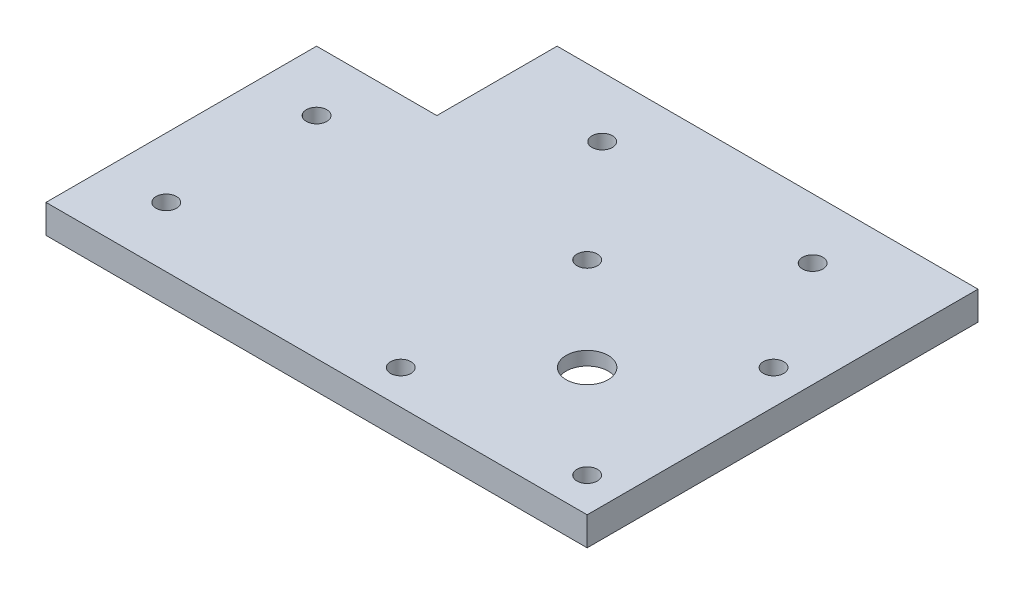
ISO-10303-21;
HEADER;
FILE_DESCRIPTION(('STEP AP214'),'2;1');
FILE_NAME('part.step','',(''),(''),'','','');
FILE_SCHEMA(('AUTOMOTIVE_DESIGN { 1 0 10303 214 1 1 1 1 }'));
ENDSEC;
DATA;
#1=APPLICATION_CONTEXT('core data for automotive mechanical design processes');
#2=APPLICATION_PROTOCOL_DEFINITION('international standard','automotive_design',2000,#1);
#3=PRODUCT_CONTEXT('',#1,'mechanical');
#4=PRODUCT('Part','Part','',(#3));
#5=PRODUCT_RELATED_PRODUCT_CATEGORY('part','',(#4));
#6=PRODUCT_DEFINITION_FORMATION('','',#4);
#7=PRODUCT_DEFINITION_CONTEXT('part definition',#1,'design');
#8=PRODUCT_DEFINITION('design','',#6,#7);
#9=PRODUCT_DEFINITION_SHAPE('','',#8);
#10=(LENGTH_UNIT() NAMED_UNIT(*) SI_UNIT(.MILLI.,.METRE.));
#11=(NAMED_UNIT(*) PLANE_ANGLE_UNIT() SI_UNIT($,.RADIAN.));
#12=(NAMED_UNIT(*) SI_UNIT($,.STERADIAN.) SOLID_ANGLE_UNIT());
#13=UNCERTAINTY_MEASURE_WITH_UNIT(LENGTH_MEASURE(1.E-05),#10,'distance_accuracy_value','');
#14=(GEOMETRIC_REPRESENTATION_CONTEXT(3) GLOBAL_UNCERTAINTY_ASSIGNED_CONTEXT((#13)) GLOBAL_UNIT_ASSIGNED_CONTEXT((#10,
#11,#12)) REPRESENTATION_CONTEXT('',''));
#15=CARTESIAN_POINT('',(0.,0.,0.));
#16=DIRECTION('',(0.,0.,1.));
#17=DIRECTION('',(1.,0.,0.));
#18=AXIS2_PLACEMENT_3D('',#15,#16,#17);
#19=CARTESIAN_POINT('',(68.7909999999999,0.,-21.209));
#20=DIRECTION('',(0.,-1.,0.));
#21=DIRECTION('',(0.,0.,-1.));
#22=AXIS2_PLACEMENT_3D('',#19,#20,#21);
#23=CYLINDRICAL_SURFACE('',#22,3.5);
#24=CARTESIAN_POINT('',(68.7909999999999,4.7625,-21.209));
#25=DIRECTION('',(0.,-1.,0.));
#26=DIRECTION('',(0.,0.,-1.));
#27=AXIS2_PLACEMENT_3D('',#24,#25,#26);
#28=CIRCLE('',#27,3.5);
#29=CARTESIAN_POINT('',(68.7909999999999,4.7625,-24.709));
#30=VERTEX_POINT('',#29);
#31=EDGE_CURVE('E124',#30,#30,#28,.T.);
#32=ORIENTED_EDGE('',*,*,#31,.F.);
#33=EDGE_LOOP('',(#32));
#34=FACE_BOUND('',#33,.T.);
#35=CARTESIAN_POINT('',(68.7909999999999,2.5,-21.209));
#36=DIRECTION('',(0.,-1.,0.));
#37=DIRECTION('',(0.,0.,-1.));
#38=AXIS2_PLACEMENT_3D('',#35,#36,#37);
#39=CIRCLE('',#38,3.5);
#40=CARTESIAN_POINT('',(68.7909999999999,2.5,-24.709));
#41=VERTEX_POINT('',#40);
#42=EDGE_CURVE('E38',#41,#41,#39,.F.);
#43=ORIENTED_EDGE('',*,*,#42,.F.);
#44=EDGE_LOOP('',(#43));
#45=FACE_BOUND('',#44,.T.);
#46=ADVANCED_FACE('F34',(#34,#45),#23,.F.);
#47=CARTESIAN_POINT('',(90.,4.7625,0.));
#48=DIRECTION('',(0.,0.,-1.));
#49=DIRECTION('',(-1.,0.,0.));
#50=AXIS2_PLACEMENT_3D('',#47,#48,#49);
#51=PLANE('',#50);
#52=DIRECTION('',(1.,0.,0.));
#53=VECTOR('',#52,1.);
#54=CARTESIAN_POINT('',(90.,0.,0.));
#55=LINE('',#54,#53);
#56=CARTESIAN_POINT('',(0.,0.,0.));
#57=VERTEX_POINT('',#56);
#58=CARTESIAN_POINT('',(90.,0.,0.));
#59=VERTEX_POINT('',#58);
#60=EDGE_CURVE('E120',#57,#59,#55,.T.);
#61=ORIENTED_EDGE('',*,*,#60,.T.);
#62=DIRECTION('',(0.,-1.,0.));
#63=VECTOR('',#62,1.);
#64=CARTESIAN_POINT('',(90.,4.7625,0.));
#65=LINE('',#64,#63);
#66=CARTESIAN_POINT('',(90.,4.7625,0.));
#67=VERTEX_POINT('',#66);
#68=EDGE_CURVE('E11',#67,#59,#65,.T.);
#69=ORIENTED_EDGE('',*,*,#68,.F.);
#70=DIRECTION('',(1.,0.,0.));
#71=VECTOR('',#70,1.);
#72=CARTESIAN_POINT('',(90.,4.7625,0.));
#73=LINE('',#72,#71);
#74=CARTESIAN_POINT('',(0.,4.7625,0.));
#75=VERTEX_POINT('',#74);
#76=EDGE_CURVE('E131',#75,#67,#73,.T.);
#77=ORIENTED_EDGE('',*,*,#76,.F.);
#78=DIRECTION('',(0.,-1.,0.));
#79=VECTOR('',#78,1.);
#80=CARTESIAN_POINT('',(0.,4.7625,0.));
#81=LINE('',#80,#79);
#82=EDGE_CURVE('E116',#75,#57,#81,.T.);
#83=ORIENTED_EDGE('',*,*,#82,.T.);
#84=EDGE_LOOP('',(#61,#69,#77,#83));
#85=FACE_BOUND('',#84,.T.);
#86=ADVANCED_FACE('F36',(#85),#51,.F.);
#87=CARTESIAN_POINT('',(90.,4.7625,0.));
#88=DIRECTION('',(-1.,0.,0.));
#89=DIRECTION('',(0.,0.,1.));
#90=AXIS2_PLACEMENT_3D('',#87,#88,#89);
#91=PLANE('',#90);
#92=DIRECTION('',(0.,0.,-1.));
#93=VECTOR('',#92,1.);
#94=CARTESIAN_POINT('',(90.,0.,0.));
#95=LINE('',#94,#93);
#96=CARTESIAN_POINT('',(90.,0.,-65.));
#97=VERTEX_POINT('',#96);
#98=EDGE_CURVE('E123',#59,#97,#95,.T.);
#99=ORIENTED_EDGE('',*,*,#98,.T.);
#100=DIRECTION('',(0.,-1.,0.));
#101=VECTOR('',#100,1.);
#102=CARTESIAN_POINT('',(90.,4.7625,-65.));
#103=LINE('',#102,#101);
#104=CARTESIAN_POINT('',(90.,4.7625,-65.));
#105=VERTEX_POINT('',#104);
#106=EDGE_CURVE('E44',#105,#97,#103,.T.);
#107=ORIENTED_EDGE('',*,*,#106,.F.);
#108=DIRECTION('',(0.,0.,-1.));
#109=VECTOR('',#108,1.);
#110=CARTESIAN_POINT('',(90.,4.7625,0.));
#111=LINE('',#110,#109);
#112=EDGE_CURVE('E89',#67,#105,#111,.T.);
#113=ORIENTED_EDGE('',*,*,#112,.F.);
#114=ORIENTED_EDGE('',*,*,#68,.T.);
#115=EDGE_LOOP('',(#99,#107,#113,#114));
#116=FACE_BOUND('',#115,.T.);
#117=ADVANCED_FACE('F162',(#116),#91,.F.);
#118=CARTESIAN_POINT('',(90.,4.7625,-65.));
#119=DIRECTION('',(0.,0.,1.));
#120=DIRECTION('',(1.,0.,0.));
#121=AXIS2_PLACEMENT_3D('',#118,#119,#120);
#122=PLANE('',#121);
#123=DIRECTION('',(-1.,0.,0.));
#124=VECTOR('',#123,1.);
#125=CARTESIAN_POINT('',(90.,0.,-65.));
#126=LINE('',#125,#124);
#127=CARTESIAN_POINT('',(20.,0.,-65.));
#128=VERTEX_POINT('',#127);
#129=EDGE_CURVE('E126',#97,#128,#126,.T.);
#130=ORIENTED_EDGE('',*,*,#129,.T.);
#131=DIRECTION('',(0.,-1.,0.));
#132=VECTOR('',#131,1.);
#133=CARTESIAN_POINT('',(20.,4.7625,-65.));
#134=LINE('',#133,#132);
#135=CARTESIAN_POINT('',(20.,4.7625,-65.));
#136=VERTEX_POINT('',#135);
#137=EDGE_CURVE('E111',#136,#128,#134,.T.);
#138=ORIENTED_EDGE('',*,*,#137,.F.);
#139=DIRECTION('',(-1.,0.,0.));
#140=VECTOR('',#139,1.);
#141=CARTESIAN_POINT('',(90.,4.7625,-65.));
#142=LINE('',#141,#140);
#143=EDGE_CURVE('E102',#105,#136,#142,.T.);
#144=ORIENTED_EDGE('',*,*,#143,.F.);
#145=ORIENTED_EDGE('',*,*,#106,.T.);
#146=EDGE_LOOP('',(#130,#138,#144,#145));
#147=FACE_BOUND('',#146,.T.);
#148=ADVANCED_FACE('F138',(#147),#122,.F.);
#149=CARTESIAN_POINT('',(20.,4.7625,-65.));
#150=DIRECTION('',(1.,0.,0.));
#151=DIRECTION('',(0.,0.,-1.));
#152=AXIS2_PLACEMENT_3D('',#149,#150,#151);
#153=PLANE('',#152);
#154=DIRECTION('',(0.,0.,1.));
#155=VECTOR('',#154,1.);
#156=CARTESIAN_POINT('',(20.,0.,-65.));
#157=LINE('',#156,#155);
#158=CARTESIAN_POINT('',(20.,0.,-45.));
#159=VERTEX_POINT('',#158);
#160=EDGE_CURVE('E110',#128,#159,#157,.T.);
#161=ORIENTED_EDGE('',*,*,#160,.T.);
#162=DIRECTION('',(0.,-1.,0.));
#163=VECTOR('',#162,1.);
#164=CARTESIAN_POINT('',(20.,4.7625,-45.));
#165=LINE('',#164,#163);
#166=CARTESIAN_POINT('',(20.,4.7625,-45.));
#167=VERTEX_POINT('',#166);
#168=EDGE_CURVE('E107',#167,#159,#165,.T.);
#169=ORIENTED_EDGE('',*,*,#168,.F.);
#170=DIRECTION('',(0.,0.,1.));
#171=VECTOR('',#170,1.);
#172=CARTESIAN_POINT('',(20.,4.7625,-65.));
#173=LINE('',#172,#171);
#174=EDGE_CURVE('E96',#136,#167,#173,.T.);
#175=ORIENTED_EDGE('',*,*,#174,.F.);
#176=ORIENTED_EDGE('',*,*,#137,.T.);
#177=EDGE_LOOP('',(#161,#169,#175,#176));
#178=FACE_BOUND('',#177,.T.);
#179=ADVANCED_FACE('F108',(#178),#153,.F.);
#180=CARTESIAN_POINT('',(0.,4.7625,-45.));
#181=DIRECTION('',(0.,0.,1.));
#182=DIRECTION('',(1.,0.,0.));
#183=AXIS2_PLACEMENT_3D('',#180,#181,#182);
#184=PLANE('',#183);
#185=DIRECTION('',(-1.,0.,0.));
#186=VECTOR('',#185,1.);
#187=CARTESIAN_POINT('',(0.,0.,-45.));
#188=LINE('',#187,#186);
#189=CARTESIAN_POINT('',(0.,0.,-45.));
#190=VERTEX_POINT('',#189);
#191=EDGE_CURVE('E75',#159,#190,#188,.T.);
#192=ORIENTED_EDGE('',*,*,#191,.T.);
#193=DIRECTION('',(0.,-1.,0.));
#194=VECTOR('',#193,1.);
#195=CARTESIAN_POINT('',(0.,4.7625,-45.));
#196=LINE('',#195,#194);
#197=CARTESIAN_POINT('',(0.,4.7625,-45.));
#198=VERTEX_POINT('',#197);
#199=EDGE_CURVE('E112',#198,#190,#196,.T.);
#200=ORIENTED_EDGE('',*,*,#199,.F.);
#201=DIRECTION('',(-1.,0.,0.));
#202=VECTOR('',#201,1.);
#203=CARTESIAN_POINT('',(0.,4.7625,-45.));
#204=LINE('',#203,#202);
#205=EDGE_CURVE('E100',#167,#198,#204,.T.);
#206=ORIENTED_EDGE('',*,*,#205,.F.);
#207=ORIENTED_EDGE('',*,*,#168,.T.);
#208=EDGE_LOOP('',(#192,#200,#206,#207));
#209=FACE_BOUND('',#208,.T.);
#210=ADVANCED_FACE('F114',(#209),#184,.F.);
#211=CARTESIAN_POINT('',(0.,4.7625,0.));
#212=DIRECTION('',(1.,0.,0.));
#213=DIRECTION('',(0.,0.,-1.));
#214=AXIS2_PLACEMENT_3D('',#211,#212,#213);
#215=PLANE('',#214);
#216=DIRECTION('',(0.,0.,1.));
#217=VECTOR('',#216,1.);
#218=CARTESIAN_POINT('',(0.,0.,0.));
#219=LINE('',#218,#217);
#220=EDGE_CURVE('E81',#190,#57,#219,.T.);
#221=ORIENTED_EDGE('',*,*,#220,.T.);
#222=ORIENTED_EDGE('',*,*,#82,.F.);
#223=DIRECTION('',(0.,0.,1.));
#224=VECTOR('',#223,1.);
#225=CARTESIAN_POINT('',(0.,4.7625,0.));
#226=LINE('',#225,#224);
#227=EDGE_CURVE('E52',#198,#75,#226,.T.);
#228=ORIENTED_EDGE('',*,*,#227,.F.);
#229=ORIENTED_EDGE('',*,*,#199,.T.);
#230=EDGE_LOOP('',(#221,#222,#228,#229));
#231=FACE_BOUND('',#230,.T.);
#232=ADVANCED_FACE('F145',(#231),#215,.F.);
#233=CARTESIAN_POINT('',(0.,4.7625,0.));
#234=DIRECTION('',(0.,-1.,0.));
#235=DIRECTION('',(0.,0.,-1.));
#236=AXIS2_PLACEMENT_3D('',#233,#234,#235);
#237=PLANE('',#236);
#238=CARTESIAN_POINT('',(10.,4.7625,-10.));
#239=DIRECTION('',(0.,-1.,0.));
#240=DIRECTION('',(0.,0.,-1.));
#241=AXIS2_PLACEMENT_3D('',#238,#239,#240);
#242=CIRCLE('',#241,1.7);
#243=CARTESIAN_POINT('',(10.,4.7625,-11.7));
#244=VERTEX_POINT('',#243);
#245=EDGE_CURVE('E252',#244,#244,#242,.T.);
#246=ORIENTED_EDGE('',*,*,#245,.T.);
#247=EDGE_LOOP('',(#246));
#248=FACE_BOUND('',#247,.T.);
#249=CARTESIAN_POINT('',(10.,4.7625,-35.));
#250=DIRECTION('',(0.,-1.,0.));
#251=DIRECTION('',(0.,0.,-1.));
#252=AXIS2_PLACEMENT_3D('',#249,#250,#251);
#253=CIRCLE('',#252,1.7);
#254=CARTESIAN_POINT('',(10.,4.7625,-36.7));
#255=VERTEX_POINT('',#254);
#256=EDGE_CURVE('E248',#255,#255,#253,.T.);
#257=ORIENTED_EDGE('',*,*,#256,.T.);
#258=EDGE_LOOP('',(#257));
#259=FACE_BOUND('',#258,.T.);
#260=CARTESIAN_POINT('',(37.5000000000002,4.7625,-55.));
#261=DIRECTION('',(0.,-1.,0.));
#262=DIRECTION('',(0.,0.,-1.));
#263=AXIS2_PLACEMENT_3D('',#260,#261,#262);
#264=CIRCLE('',#263,1.7);
#265=CARTESIAN_POINT('',(37.5000000000002,4.7625,-56.7));
#266=VERTEX_POINT('',#265);
#267=EDGE_CURVE('E244',#266,#266,#264,.T.);
#268=ORIENTED_EDGE('',*,*,#267,.T.);
#269=EDGE_LOOP('',(#268));
#270=FACE_BOUND('',#269,.T.);
#271=CARTESIAN_POINT('',(72.5000000000003,4.7625,-55.));
#272=DIRECTION('',(0.,-1.,0.));
#273=DIRECTION('',(0.,0.,-1.));
#274=AXIS2_PLACEMENT_3D('',#271,#272,#273);
#275=CIRCLE('',#274,1.69999999999999);
#276=CARTESIAN_POINT('',(72.5000000000003,4.7625,-56.7));
#277=VERTEX_POINT('',#276);
#278=EDGE_CURVE('E240',#277,#277,#275,.T.);
#279=ORIENTED_EDGE('',*,*,#278,.T.);
#280=EDGE_LOOP('',(#279));
#281=FACE_BOUND('',#280,.T.);
#282=CARTESIAN_POINT('',(84.2909999999999,4.7625,-36.709));
#283=DIRECTION('',(0.,-1.,0.));
#284=DIRECTION('',(0.,0.,-1.));
#285=AXIS2_PLACEMENT_3D('',#282,#283,#284);
#286=CIRCLE('',#285,1.69999999999999);
#287=CARTESIAN_POINT('',(84.2909999999999,4.7625,-38.409));
#288=VERTEX_POINT('',#287);
#289=EDGE_CURVE('E236',#288,#288,#286,.T.);
#290=ORIENTED_EDGE('',*,*,#289,.T.);
#291=EDGE_LOOP('',(#290));
#292=FACE_BOUND('',#291,.T.);
#293=CARTESIAN_POINT('',(84.2909999999999,4.7625,-5.70900000000003));
#294=DIRECTION('',(0.,-1.,0.));
#295=DIRECTION('',(0.,0.,-1.));
#296=AXIS2_PLACEMENT_3D('',#293,#294,#295);
#297=CIRCLE('',#296,1.69999999999999);
#298=CARTESIAN_POINT('',(84.2909999999999,4.7625,-7.40900000000002));
#299=VERTEX_POINT('',#298);
#300=EDGE_CURVE('E232',#299,#299,#297,.T.);
#301=ORIENTED_EDGE('',*,*,#300,.T.);
#302=EDGE_LOOP('',(#301));
#303=FACE_BOUND('',#302,.T.);
#304=CARTESIAN_POINT('',(53.2909999999999,4.7625,-5.70900000000003));
#305=DIRECTION('',(0.,-1.,0.));
#306=DIRECTION('',(0.,0.,-1.));
#307=AXIS2_PLACEMENT_3D('',#304,#305,#306);
#308=CIRCLE('',#307,1.7);
#309=CARTESIAN_POINT('',(53.2909999999999,4.7625,-7.40900000000003));
#310=VERTEX_POINT('',#309);
#311=EDGE_CURVE('E228',#310,#310,#308,.T.);
#312=ORIENTED_EDGE('',*,*,#311,.T.);
#313=EDGE_LOOP('',(#312));
#314=FACE_BOUND('',#313,.T.);
#315=CARTESIAN_POINT('',(53.2909999999999,4.7625,-36.709));
#316=DIRECTION('',(0.,-1.,0.));
#317=DIRECTION('',(0.,0.,-1.));
#318=AXIS2_PLACEMENT_3D('',#315,#316,#317);
#319=CIRCLE('',#318,1.7);
#320=CARTESIAN_POINT('',(53.2909999999999,4.7625,-38.409));
#321=VERTEX_POINT('',#320);
#322=EDGE_CURVE('E212',#321,#321,#319,.T.);
#323=ORIENTED_EDGE('',*,*,#322,.T.);
#324=EDGE_LOOP('',(#323));
#325=FACE_BOUND('',#324,.T.);
#326=ORIENTED_EDGE('',*,*,#31,.T.);
#327=EDGE_LOOP('',(#326));
#328=FACE_BOUND('',#327,.T.);
#329=ORIENTED_EDGE('',*,*,#76,.T.);
#330=ORIENTED_EDGE('',*,*,#112,.T.);
#331=ORIENTED_EDGE('',*,*,#143,.T.);
#332=ORIENTED_EDGE('',*,*,#174,.T.);
#333=ORIENTED_EDGE('',*,*,#205,.T.);
#334=ORIENTED_EDGE('',*,*,#227,.T.);
#335=EDGE_LOOP('',(#329,#330,#331,#332,#333,#334));
#336=FACE_BOUND('',#335,.T.);
#337=ADVANCED_FACE('F98',(#248,#259,#270,#281,#292,#303,#314,#325,#328,#336),#237,.F.);
#338=CARTESIAN_POINT('',(0.,0.,0.));
#339=DIRECTION('',(0.,-1.,0.));
#340=DIRECTION('',(0.,0.,-1.));
#341=AXIS2_PLACEMENT_3D('',#338,#339,#340);
#342=PLANE('',#341);
#343=CARTESIAN_POINT('',(10.,0.,-10.));
#344=DIRECTION('',(0.,-1.,0.));
#345=DIRECTION('',(0.,0.,-1.));
#346=AXIS2_PLACEMENT_3D('',#343,#344,#345);
#347=CIRCLE('',#346,1.69999999999999);
#348=CARTESIAN_POINT('',(10.,0.,-11.7));
#349=VERTEX_POINT('',#348);
#350=EDGE_CURVE('E178',#349,#349,#347,.T.);
#351=ORIENTED_EDGE('',*,*,#350,.F.);
#352=EDGE_LOOP('',(#351));
#353=FACE_BOUND('',#352,.T.);
#354=CARTESIAN_POINT('',(10.,0.,-35.));
#355=DIRECTION('',(0.,-1.,0.));
#356=DIRECTION('',(0.,0.,-1.));
#357=AXIS2_PLACEMENT_3D('',#354,#355,#356);
#358=CIRCLE('',#357,1.69999999999999);
#359=CARTESIAN_POINT('',(10.,0.,-36.7));
#360=VERTEX_POINT('',#359);
#361=EDGE_CURVE('E182',#360,#360,#358,.T.);
#362=ORIENTED_EDGE('',*,*,#361,.F.);
#363=EDGE_LOOP('',(#362));
#364=FACE_BOUND('',#363,.T.);
#365=CARTESIAN_POINT('',(37.5000000000002,0.,-55.));
#366=DIRECTION('',(0.,-1.,0.));
#367=DIRECTION('',(0.,0.,-1.));
#368=AXIS2_PLACEMENT_3D('',#365,#366,#367);
#369=CIRCLE('',#368,1.69999999999999);
#370=CARTESIAN_POINT('',(37.5000000000002,0.,-56.7));
#371=VERTEX_POINT('',#370);
#372=EDGE_CURVE('E186',#371,#371,#369,.T.);
#373=ORIENTED_EDGE('',*,*,#372,.F.);
#374=EDGE_LOOP('',(#373));
#375=FACE_BOUND('',#374,.T.);
#376=CARTESIAN_POINT('',(72.5000000000003,0.,-55.));
#377=DIRECTION('',(0.,-1.,0.));
#378=DIRECTION('',(0.,0.,-1.));
#379=AXIS2_PLACEMENT_3D('',#376,#377,#378);
#380=CIRCLE('',#379,1.69999999999999);
#381=CARTESIAN_POINT('',(72.5000000000003,0.,-56.7));
#382=VERTEX_POINT('',#381);
#383=EDGE_CURVE('E190',#382,#382,#380,.T.);
#384=ORIENTED_EDGE('',*,*,#383,.F.);
#385=EDGE_LOOP('',(#384));
#386=FACE_BOUND('',#385,.T.);
#387=CARTESIAN_POINT('',(84.2909999999999,0.,-36.709));
#388=DIRECTION('',(0.,-1.,0.));
#389=DIRECTION('',(0.,0.,-1.));
#390=AXIS2_PLACEMENT_3D('',#387,#388,#389);
#391=CIRCLE('',#390,1.69999999999999);
#392=CARTESIAN_POINT('',(84.2909999999999,0.,-38.409));
#393=VERTEX_POINT('',#392);
#394=EDGE_CURVE('E194',#393,#393,#391,.T.);
#395=ORIENTED_EDGE('',*,*,#394,.F.);
#396=EDGE_LOOP('',(#395));
#397=FACE_BOUND('',#396,.T.);
#398=CARTESIAN_POINT('',(84.2909999999999,0.,-5.70900000000003));
#399=DIRECTION('',(0.,-1.,0.));
#400=DIRECTION('',(0.,0.,-1.));
#401=AXIS2_PLACEMENT_3D('',#398,#399,#400);
#402=CIRCLE('',#401,1.69999999999999);
#403=CARTESIAN_POINT('',(84.2909999999999,0.,-7.40900000000002));
#404=VERTEX_POINT('',#403);
#405=EDGE_CURVE('E198',#404,#404,#402,.T.);
#406=ORIENTED_EDGE('',*,*,#405,.F.);
#407=EDGE_LOOP('',(#406));
#408=FACE_BOUND('',#407,.T.);
#409=CARTESIAN_POINT('',(53.2909999999999,0.,-5.70900000000003));
#410=DIRECTION('',(0.,-1.,0.));
#411=DIRECTION('',(0.,0.,-1.));
#412=AXIS2_PLACEMENT_3D('',#409,#410,#411);
#413=CIRCLE('',#412,1.69999999999999);
#414=CARTESIAN_POINT('',(53.2909999999999,0.,-7.40900000000001));
#415=VERTEX_POINT('',#414);
#416=EDGE_CURVE('E202',#415,#415,#413,.T.);
#417=ORIENTED_EDGE('',*,*,#416,.F.);
#418=EDGE_LOOP('',(#417));
#419=FACE_BOUND('',#418,.T.);
#420=CARTESIAN_POINT('',(53.2909999999999,0.,-36.709));
#421=DIRECTION('',(0.,-1.,0.));
#422=DIRECTION('',(0.,0.,-1.));
#423=AXIS2_PLACEMENT_3D('',#420,#421,#422);
#424=CIRCLE('',#423,1.69999999999999);
#425=CARTESIAN_POINT('',(53.2909999999999,0.,-38.409));
#426=VERTEX_POINT('',#425);
#427=EDGE_CURVE('E206',#426,#426,#424,.T.);
#428=ORIENTED_EDGE('',*,*,#427,.F.);
#429=EDGE_LOOP('',(#428));
#430=FACE_BOUND('',#429,.T.);
#431=CARTESIAN_POINT('',(68.7909999999999,0.,-21.209));
#432=DIRECTION('',(0.,-1.,0.));
#433=DIRECTION('',(0.,0.,-1.));
#434=AXIS2_PLACEMENT_3D('',#431,#432,#433);
#435=CIRCLE('',#434,11.5);
#436=CARTESIAN_POINT('',(68.7909999999999,0.,-32.709));
#437=VERTEX_POINT('',#436);
#438=EDGE_CURVE('E209',#437,#437,#435,.T.);
#439=ORIENTED_EDGE('',*,*,#438,.F.);
#440=EDGE_LOOP('',(#439));
#441=FACE_BOUND('',#440,.T.);
#442=ORIENTED_EDGE('',*,*,#60,.F.);
#443=ORIENTED_EDGE('',*,*,#220,.F.);
#444=ORIENTED_EDGE('',*,*,#191,.F.);
#445=ORIENTED_EDGE('',*,*,#160,.F.);
#446=ORIENTED_EDGE('',*,*,#129,.F.);
#447=ORIENTED_EDGE('',*,*,#98,.F.);
#448=EDGE_LOOP('',(#442,#443,#444,#445,#446,#447));
#449=FACE_BOUND('',#448,.T.);
#450=ADVANCED_FACE('F141',(#353,#364,#375,#386,#397,#408,#419,#430,#441,#449),#342,.T.);
#451=CARTESIAN_POINT('',(68.7909999999999,2.5,-21.209));
#452=DIRECTION('',(0.,-1.,0.));
#453=DIRECTION('',(0.,0.,-1.));
#454=AXIS2_PLACEMENT_3D('',#451,#452,#453);
#455=PLANE('',#454);
#456=CARTESIAN_POINT('',(68.7909999999999,2.5,-21.209));
#457=DIRECTION('',(0.,-1.,0.));
#458=DIRECTION('',(0.,0.,-1.));
#459=AXIS2_PLACEMENT_3D('',#456,#457,#458);
#460=CIRCLE('',#459,11.5);
#461=CARTESIAN_POINT('',(68.7909999999999,2.5,-32.709));
#462=VERTEX_POINT('',#461);
#463=EDGE_CURVE('E211',#462,#462,#460,.T.);
#464=ORIENTED_EDGE('',*,*,#463,.T.);
#465=EDGE_LOOP('',(#464));
#466=FACE_BOUND('',#465,.T.);
#467=ORIENTED_EDGE('',*,*,#42,.T.);
#468=EDGE_LOOP('',(#467));
#469=FACE_BOUND('',#468,.T.);
#470=ADVANCED_FACE('F169',(#466,#469),#455,.T.);
#471=CARTESIAN_POINT('',(68.7909999999999,2.5,-21.209));
#472=DIRECTION('',(0.,-1.,0.));
#473=DIRECTION('',(0.,0.,-1.));
#474=AXIS2_PLACEMENT_3D('',#471,#472,#473);
#475=CYLINDRICAL_SURFACE('',#474,11.5);
#476=ORIENTED_EDGE('',*,*,#463,.F.);
#477=EDGE_LOOP('',(#476));
#478=FACE_BOUND('',#477,.T.);
#479=ORIENTED_EDGE('',*,*,#438,.T.);
#480=EDGE_LOOP('',(#479));
#481=FACE_BOUND('',#480,.T.);
#482=ADVANCED_FACE('F166',(#478,#481),#475,.F.);
#483=CARTESIAN_POINT('',(53.2909999999999,0.,-36.709));
#484=DIRECTION('',(0.,-1.,0.));
#485=DIRECTION('',(0.,0.,-1.));
#486=AXIS2_PLACEMENT_3D('',#483,#484,#485);
#487=CYLINDRICAL_SURFACE('',#486,1.69999999999999);
#488=ORIENTED_EDGE('',*,*,#322,.F.);
#489=EDGE_LOOP('',(#488));
#490=FACE_BOUND('',#489,.T.);
#491=ORIENTED_EDGE('',*,*,#427,.T.);
#492=EDGE_LOOP('',(#491));
#493=FACE_BOUND('',#492,.T.);
#494=ADVANCED_FACE('F287',(#490,#493),#487,.F.);
#495=CARTESIAN_POINT('',(53.2909999999999,0.,-5.70900000000003));
#496=DIRECTION('',(0.,-1.,0.));
#497=DIRECTION('',(0.,0.,-1.));
#498=AXIS2_PLACEMENT_3D('',#495,#496,#497);
#499=CYLINDRICAL_SURFACE('',#498,1.69999999999999);
#500=ORIENTED_EDGE('',*,*,#311,.F.);
#501=EDGE_LOOP('',(#500));
#502=FACE_BOUND('',#501,.T.);
#503=ORIENTED_EDGE('',*,*,#416,.T.);
#504=EDGE_LOOP('',(#503));
#505=FACE_BOUND('',#504,.T.);
#506=ADVANCED_FACE('F283',(#502,#505),#499,.F.);
#507=CARTESIAN_POINT('',(84.2909999999999,0.,-5.70900000000003));
#508=DIRECTION('',(0.,-1.,0.));
#509=DIRECTION('',(0.,0.,-1.));
#510=AXIS2_PLACEMENT_3D('',#507,#508,#509);
#511=CYLINDRICAL_SURFACE('',#510,1.69999999999999);
#512=ORIENTED_EDGE('',*,*,#300,.F.);
#513=EDGE_LOOP('',(#512));
#514=FACE_BOUND('',#513,.T.);
#515=ORIENTED_EDGE('',*,*,#405,.T.);
#516=EDGE_LOOP('',(#515));
#517=FACE_BOUND('',#516,.T.);
#518=ADVANCED_FACE('F279',(#514,#517),#511,.F.);
#519=CARTESIAN_POINT('',(84.2909999999999,0.,-36.709));
#520=DIRECTION('',(0.,-1.,0.));
#521=DIRECTION('',(0.,0.,-1.));
#522=AXIS2_PLACEMENT_3D('',#519,#520,#521);
#523=CYLINDRICAL_SURFACE('',#522,1.69999999999999);
#524=ORIENTED_EDGE('',*,*,#289,.F.);
#525=EDGE_LOOP('',(#524));
#526=FACE_BOUND('',#525,.T.);
#527=ORIENTED_EDGE('',*,*,#394,.T.);
#528=EDGE_LOOP('',(#527));
#529=FACE_BOUND('',#528,.T.);
#530=ADVANCED_FACE('F275',(#526,#529),#523,.F.);
#531=CARTESIAN_POINT('',(72.5000000000003,0.,-55.));
#532=DIRECTION('',(0.,-1.,0.));
#533=DIRECTION('',(0.,0.,-1.));
#534=AXIS2_PLACEMENT_3D('',#531,#532,#533);
#535=CYLINDRICAL_SURFACE('',#534,1.69999999999999);
#536=ORIENTED_EDGE('',*,*,#278,.F.);
#537=EDGE_LOOP('',(#536));
#538=FACE_BOUND('',#537,.T.);
#539=ORIENTED_EDGE('',*,*,#383,.T.);
#540=EDGE_LOOP('',(#539));
#541=FACE_BOUND('',#540,.T.);
#542=ADVANCED_FACE('F271',(#538,#541),#535,.F.);
#543=CARTESIAN_POINT('',(37.5000000000002,0.,-55.));
#544=DIRECTION('',(0.,-1.,0.));
#545=DIRECTION('',(0.,0.,-1.));
#546=AXIS2_PLACEMENT_3D('',#543,#544,#545);
#547=CYLINDRICAL_SURFACE('',#546,1.69999999999999);
#548=ORIENTED_EDGE('',*,*,#267,.F.);
#549=EDGE_LOOP('',(#548));
#550=FACE_BOUND('',#549,.T.);
#551=ORIENTED_EDGE('',*,*,#372,.T.);
#552=EDGE_LOOP('',(#551));
#553=FACE_BOUND('',#552,.T.);
#554=ADVANCED_FACE('F264',(#550,#553),#547,.F.);
#555=CARTESIAN_POINT('',(10.,0.,-35.));
#556=DIRECTION('',(0.,-1.,0.));
#557=DIRECTION('',(0.,0.,-1.));
#558=AXIS2_PLACEMENT_3D('',#555,#556,#557);
#559=CYLINDRICAL_SURFACE('',#558,1.69999999999999);
#560=ORIENTED_EDGE('',*,*,#256,.F.);
#561=EDGE_LOOP('',(#560));
#562=FACE_BOUND('',#561,.T.);
#563=ORIENTED_EDGE('',*,*,#361,.T.);
#564=EDGE_LOOP('',(#563));
#565=FACE_BOUND('',#564,.T.);
#566=ADVANCED_FACE('F258',(#562,#565),#559,.F.);
#567=CARTESIAN_POINT('',(10.,0.,-10.));
#568=DIRECTION('',(0.,-1.,0.));
#569=DIRECTION('',(0.,0.,-1.));
#570=AXIS2_PLACEMENT_3D('',#567,#568,#569);
#571=CYLINDRICAL_SURFACE('',#570,1.69999999999999);
#572=ORIENTED_EDGE('',*,*,#245,.F.);
#573=EDGE_LOOP('',(#572));
#574=FACE_BOUND('',#573,.T.);
#575=ORIENTED_EDGE('',*,*,#350,.T.);
#576=EDGE_LOOP('',(#575));
#577=FACE_BOUND('',#576,.T.);
#578=ADVANCED_FACE('F256',(#574,#577),#571,.F.);
#579=CLOSED_SHELL('',(#46,#86,#117,#148,#179,#210,#232,#337,#450,#470,#482,#494,#506,#518,#530,
#542,#554,#566,#578));
#580=MANIFOLD_SOLID_BREP('B2',#579);
#581=ADVANCED_BREP_SHAPE_REPRESENTATION('',(#18,#580),#14);
#582=SHAPE_DEFINITION_REPRESENTATION(#9,#581);
ENDSEC;
END-ISO-10303-21;
